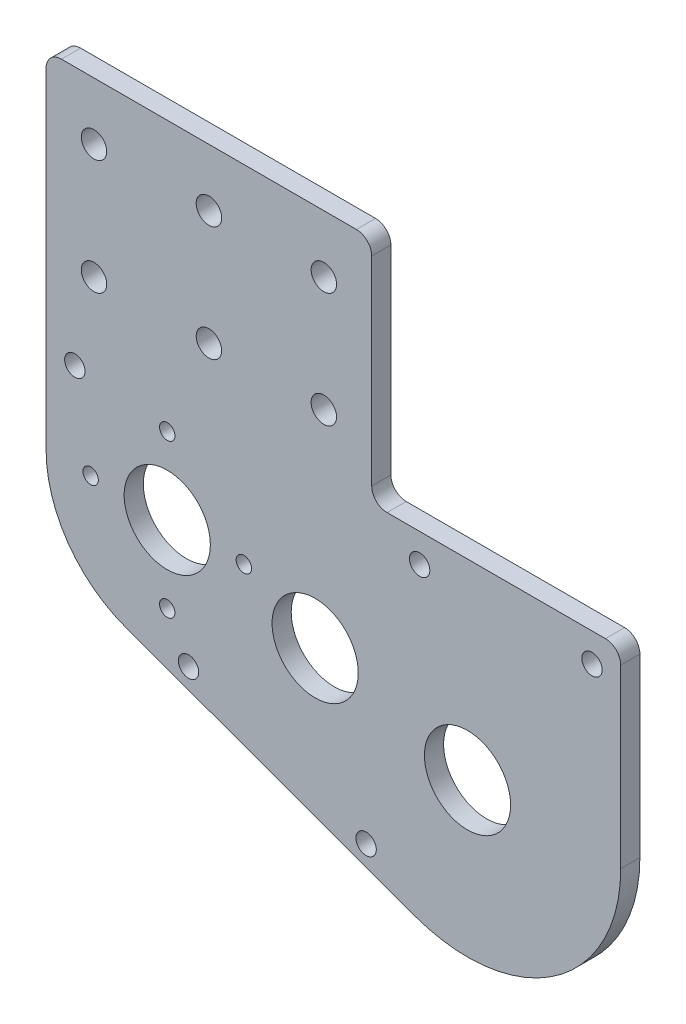
ISO-10303-21;
HEADER;
FILE_DESCRIPTION(('STEP AP214'),'2;1');
FILE_NAME('part.step','',(''),(''),'','','');
FILE_SCHEMA(('AUTOMOTIVE_DESIGN { 1 0 10303 214 1 1 1 1 }'));
ENDSEC;
DATA;
#1=APPLICATION_CONTEXT('core data for automotive mechanical design processes');
#2=APPLICATION_PROTOCOL_DEFINITION('international standard','automotive_design',2000,#1);
#3=PRODUCT_CONTEXT('',#1,'mechanical');
#4=PRODUCT('Part','Part','',(#3));
#5=PRODUCT_RELATED_PRODUCT_CATEGORY('part','',(#4));
#6=PRODUCT_DEFINITION_FORMATION('','',#4);
#7=PRODUCT_DEFINITION_CONTEXT('part definition',#1,'design');
#8=PRODUCT_DEFINITION('design','',#6,#7);
#9=PRODUCT_DEFINITION_SHAPE('','',#8);
#10=(LENGTH_UNIT() NAMED_UNIT(*) SI_UNIT(.MILLI.,.METRE.));
#11=(NAMED_UNIT(*) PLANE_ANGLE_UNIT() SI_UNIT($,.RADIAN.));
#12=(NAMED_UNIT(*) SI_UNIT($,.STERADIAN.) SOLID_ANGLE_UNIT());
#13=UNCERTAINTY_MEASURE_WITH_UNIT(LENGTH_MEASURE(1.E-05),#10,'distance_accuracy_value','');
#14=(GEOMETRIC_REPRESENTATION_CONTEXT(3) GLOBAL_UNCERTAINTY_ASSIGNED_CONTEXT((#13)) GLOBAL_UNIT_ASSIGNED_CONTEXT((#10,
#11,#12)) REPRESENTATION_CONTEXT('',''));
#15=CARTESIAN_POINT('',(0.,0.,0.));
#16=DIRECTION('',(0.,0.,1.));
#17=DIRECTION('',(1.,0.,0.));
#18=AXIS2_PLACEMENT_3D('',#15,#16,#17);
#19=CARTESIAN_POINT('',(50.8,63.5,-6.35));
#20=DIRECTION('',(0.,1.,0.));
#21=DIRECTION('',(-1.,0.,0.));
#22=AXIS2_PLACEMENT_3D('',#19,#20,#21);
#23=PLANE('',#22);
#24=DIRECTION('',(-1.,0.,0.));
#25=VECTOR('',#24,1.);
#26=CARTESIAN_POINT('',(50.8,63.5,0.));
#27=LINE('',#26,#25);
#28=CARTESIAN_POINT('',(45.72,63.5,0.));
#29=VERTEX_POINT('',#28);
#30=CARTESIAN_POINT('',(-26.67,63.5,0.));
#31=VERTEX_POINT('',#30);
#32=EDGE_CURVE('E167',#29,#31,#27,.T.);
#33=ORIENTED_EDGE('',*,*,#32,.F.);
#34=DIRECTION('',(0.,0.,1.));
#35=VECTOR('',#34,1.);
#36=CARTESIAN_POINT('',(45.72,63.5,-6.35));
#37=LINE('',#36,#35);
#38=CARTESIAN_POINT('',(45.72,63.5,-6.35));
#39=VERTEX_POINT('',#38);
#40=EDGE_CURVE('E198',#29,#39,#37,.F.);
#41=ORIENTED_EDGE('',*,*,#40,.T.);
#42=DIRECTION('',(-1.,0.,0.));
#43=VECTOR('',#42,1.);
#44=CARTESIAN_POINT('',(50.8,63.5,-6.35));
#45=LINE('',#44,#43);
#46=CARTESIAN_POINT('',(-26.67,63.5,-6.35));
#47=VERTEX_POINT('',#46);
#48=EDGE_CURVE('E142',#39,#47,#45,.T.);
#49=ORIENTED_EDGE('',*,*,#48,.T.);
#50=DIRECTION('',(0.,0.,1.));
#51=VECTOR('',#50,1.);
#52=CARTESIAN_POINT('',(-26.67,63.5,0.));
#53=LINE('',#52,#51);
#54=EDGE_CURVE('E195',#47,#31,#53,.T.);
#55=ORIENTED_EDGE('',*,*,#54,.T.);
#56=EDGE_LOOP('',(#33,#41,#49,#55));
#57=FACE_BOUND('',#56,.T.);
#58=ADVANCED_FACE('F41',(#57),#23,.T.);
#59=CARTESIAN_POINT('',(50.8,63.5,-6.35));
#60=DIRECTION('',(1.,0.,0.));
#61=DIRECTION('',(0.,0.,-1.));
#62=AXIS2_PLACEMENT_3D('',#59,#60,#61);
#63=PLANE('',#62);
#64=DIRECTION('',(0.,1.,0.));
#65=VECTOR('',#64,1.);
#66=CARTESIAN_POINT('',(50.8,63.5,-6.35));
#67=LINE('',#66,#65);
#68=CARTESIAN_POINT('',(50.8,0.,-6.35));
#69=VERTEX_POINT('',#68);
#70=CARTESIAN_POINT('',(50.8,58.42,-6.35));
#71=VERTEX_POINT('',#70);
#72=EDGE_CURVE('E180',#69,#71,#67,.T.);
#73=ORIENTED_EDGE('',*,*,#72,.T.);
#74=DIRECTION('',(0.,0.,1.));
#75=VECTOR('',#74,1.);
#76=CARTESIAN_POINT('',(50.8,58.42,-6.35));
#77=LINE('',#76,#75);
#78=CARTESIAN_POINT('',(50.8,58.42,0.));
#79=VERTEX_POINT('',#78);
#80=EDGE_CURVE('E183',#71,#79,#77,.T.);
#81=ORIENTED_EDGE('',*,*,#80,.T.);
#82=DIRECTION('',(0.,1.,0.));
#83=VECTOR('',#82,1.);
#84=CARTESIAN_POINT('',(50.8,63.5,0.));
#85=LINE('',#84,#83);
#86=CARTESIAN_POINT('',(50.8,0.,0.));
#87=VERTEX_POINT('',#86);
#88=EDGE_CURVE('E164',#87,#79,#85,.T.);
#89=ORIENTED_EDGE('',*,*,#88,.F.);
#90=DIRECTION('',(0.,0.,1.));
#91=VECTOR('',#90,1.);
#92=CARTESIAN_POINT('',(50.8,0.,-6.35));
#93=LINE('',#92,#91);
#94=EDGE_CURVE('E181',#69,#87,#93,.T.);
#95=ORIENTED_EDGE('',*,*,#94,.F.);
#96=EDGE_LOOP('',(#73,#81,#89,#95));
#97=FACE_BOUND('',#96,.T.);
#98=ADVANCED_FACE('F399',(#97),#63,.T.);
#99=CARTESIAN_POINT('',(0.,0.,-6.35));
#100=DIRECTION('',(0.,0.,1.));
#101=DIRECTION('',(1.,0.,0.));
#102=AXIS2_PLACEMENT_3D('',#99,#100,#101);
#103=CYLINDRICAL_SURFACE('',#102,50.8);
#104=CARTESIAN_POINT('',(0.,0.,0.));
#105=DIRECTION('',(0.,0.,1.));
#106=DIRECTION('',(-1.,0.,0.));
#107=AXIS2_PLACEMENT_3D('',#104,#105,#106);
#108=CIRCLE('',#107,50.8);
#109=CARTESIAN_POINT('',(-17.3899869073601,-47.7307904330302,0.));
#110=VERTEX_POINT('',#109);
#111=EDGE_CURVE('E177',#110,#87,#108,.T.);
#112=ORIENTED_EDGE('',*,*,#111,.F.);
#113=DIRECTION('',(0.,0.,1.));
#114=VECTOR('',#113,1.);
#115=CARTESIAN_POINT('',(-17.3899869073601,-47.7307904330302,-6.35));
#116=LINE('',#115,#114);
#117=CARTESIAN_POINT('',(-17.3899869073601,-47.7307904330302,-6.35));
#118=VERTEX_POINT('',#117);
#119=EDGE_CURVE('E184',#118,#110,#116,.T.);
#120=ORIENTED_EDGE('',*,*,#119,.F.);
#121=CARTESIAN_POINT('',(0.,0.,-6.35));
#122=DIRECTION('',(0.,0.,1.));
#123=DIRECTION('',(-1.,0.,0.));
#124=AXIS2_PLACEMENT_3D('',#121,#122,#123);
#125=CIRCLE('',#124,50.8);
#126=EDGE_CURVE('E150',#118,#69,#125,.T.);
#127=ORIENTED_EDGE('',*,*,#126,.T.);
#128=ORIENTED_EDGE('',*,*,#94,.T.);
#129=EDGE_LOOP('',(#112,#120,#127,#128));
#130=FACE_BOUND('',#129,.T.);
#131=ADVANCED_FACE('F405',(#130),#103,.T.);
#132=CARTESIAN_POINT('',(-17.3899869073601,-47.7307904330302,-6.35));
#133=DIRECTION('',(-0.342322576916537,-0.939582488839176,0.));
#134=DIRECTION('',(0.939582488839177,-0.342322576916537,0.));
#135=AXIS2_PLACEMENT_3D('',#132,#133,#134);
#136=PLANE('',#135);
#137=DIRECTION('',(0.939582488839176,-0.342322576916537,0.));
#138=VECTOR('',#137,1.);
#139=CARTESIAN_POINT('',(-17.3899869073601,-47.7307904330302,0.));
#140=LINE('',#139,#138);
#141=CARTESIAN_POINT('',(-113.286645892622,-12.7923025286006,0.));
#142=VERTEX_POINT('',#141);
#143=EDGE_CURVE('E174',#142,#110,#140,.T.);
#144=ORIENTED_EDGE('',*,*,#143,.F.);
#145=DIRECTION('',(0.,0.,1.));
#146=VECTOR('',#145,1.);
#147=CARTESIAN_POINT('',(-113.286645892622,-12.7923025286006,-6.35));
#148=LINE('',#147,#146);
#149=CARTESIAN_POINT('',(-113.286645892622,-12.7923025286006,-6.35));
#150=VERTEX_POINT('',#149);
#151=EDGE_CURVE('E149',#150,#142,#148,.T.);
#152=ORIENTED_EDGE('',*,*,#151,.F.);
#153=DIRECTION('',(0.939582488839176,-0.342322576916537,0.));
#154=VECTOR('',#153,1.);
#155=CARTESIAN_POINT('',(-17.3899869073601,-47.7307904330302,-6.35));
#156=LINE('',#155,#154);
#157=EDGE_CURVE('E157',#150,#118,#156,.T.);
#158=ORIENTED_EDGE('',*,*,#157,.T.);
#159=ORIENTED_EDGE('',*,*,#119,.T.);
#160=EDGE_LOOP('',(#144,#152,#158,#159));
#161=FACE_BOUND('',#160,.T.);
#162=ADVANCED_FACE('F432',(#161),#136,.T.);
#163=CARTESIAN_POINT('',(-99.5384357128441,24.9428,-6.35));
#164=DIRECTION('',(0.,0.,1.));
#165=DIRECTION('',(1.,0.,0.));
#166=AXIS2_PLACEMENT_3D('',#163,#164,#165);
#167=CYLINDRICAL_SURFACE('',#166,40.1615642871559);
#168=CARTESIAN_POINT('',(-99.5384357128441,24.9428,0.));
#169=DIRECTION('',(0.,0.,1.));
#170=DIRECTION('',(-1.,0.,0.));
#171=AXIS2_PLACEMENT_3D('',#168,#169,#170);
#172=CIRCLE('',#171,40.1615642871559);
#173=CARTESIAN_POINT('',(-139.7,24.9428,0.));
#174=VERTEX_POINT('',#173);
#175=EDGE_CURVE('E148',#174,#142,#172,.T.);
#176=ORIENTED_EDGE('',*,*,#175,.F.);
#177=DIRECTION('',(0.,0.,1.));
#178=VECTOR('',#177,1.);
#179=CARTESIAN_POINT('',(-139.7,24.9428,-6.35));
#180=LINE('',#179,#178);
#181=CARTESIAN_POINT('',(-139.7,24.9428,-6.35));
#182=VERTEX_POINT('',#181);
#183=EDGE_CURVE('E135',#182,#174,#180,.T.);
#184=ORIENTED_EDGE('',*,*,#183,.F.);
#185=CARTESIAN_POINT('',(-99.5384357128441,24.9428,-6.35));
#186=DIRECTION('',(0.,0.,1.));
#187=DIRECTION('',(-1.,0.,0.));
#188=AXIS2_PLACEMENT_3D('',#185,#186,#187);
#189=CIRCLE('',#188,40.1615642871559);
#190=EDGE_CURVE('E141',#182,#150,#189,.T.);
#191=ORIENTED_EDGE('',*,*,#190,.T.);
#192=ORIENTED_EDGE('',*,*,#151,.T.);
#193=EDGE_LOOP('',(#176,#184,#191,#192));
#194=FACE_BOUND('',#193,.T.);
#195=ADVANCED_FACE('F146',(#194),#167,.T.);
#196=CARTESIAN_POINT('',(-139.7,24.9428,-6.35));
#197=DIRECTION('',(-1.,0.,0.));
#198=DIRECTION('',(0.,-1.,0.));
#199=AXIS2_PLACEMENT_3D('',#196,#197,#198);
#200=PLANE('',#199);
#201=DIRECTION('',(0.,-1.,0.));
#202=VECTOR('',#201,1.);
#203=CARTESIAN_POINT('',(-139.7,24.9428,0.));
#204=LINE('',#203,#202);
#205=CARTESIAN_POINT('',(-139.7,134.62,0.));
#206=VERTEX_POINT('',#205);
#207=EDGE_CURVE('E171',#206,#174,#204,.T.);
#208=ORIENTED_EDGE('',*,*,#207,.F.);
#209=DIRECTION('',(0.,0.,1.));
#210=VECTOR('',#209,1.);
#211=CARTESIAN_POINT('',(-139.7,134.62,-6.35));
#212=LINE('',#211,#210);
#213=CARTESIAN_POINT('',(-139.7,134.62,-6.35));
#214=VERTEX_POINT('',#213);
#215=EDGE_CURVE('E138',#206,#214,#212,.F.);
#216=ORIENTED_EDGE('',*,*,#215,.T.);
#217=DIRECTION('',(0.,-1.,0.));
#218=VECTOR('',#217,1.);
#219=CARTESIAN_POINT('',(-139.7,24.9428,-6.35));
#220=LINE('',#219,#218);
#221=EDGE_CURVE('E131',#214,#182,#220,.T.);
#222=ORIENTED_EDGE('',*,*,#221,.T.);
#223=ORIENTED_EDGE('',*,*,#183,.T.);
#224=EDGE_LOOP('',(#208,#216,#222,#223));
#225=FACE_BOUND('',#224,.T.);
#226=ADVANCED_FACE('F134',(#225),#200,.T.);
#227=CARTESIAN_POINT('',(0.,0.,-6.35));
#228=DIRECTION('',(0.,0.,-1.));
#229=DIRECTION('',(-1.,0.,0.));
#230=AXIS2_PLACEMENT_3D('',#227,#228,#229);
#231=PLANE('',#230);
#232=CARTESIAN_POINT('',(-47.625,82.55,-6.35));
#233=DIRECTION('',(0.,0.,-1.));
#234=DIRECTION('',(-1.,0.,0.));
#235=AXIS2_PLACEMENT_3D('',#232,#233,#234);
#236=CIRCLE('',#235,4.21640000000001);
#237=CARTESIAN_POINT('',(-51.8414,82.55,-6.35));
#238=VERTEX_POINT('',#237);
#239=EDGE_CURVE('E331',#238,#238,#236,.F.);
#240=ORIENTED_EDGE('',*,*,#239,.T.);
#241=EDGE_LOOP('',(#240));
#242=FACE_BOUND('',#241,.T.);
#243=CARTESIAN_POINT('',(-85.725,82.55,-6.35));
#244=DIRECTION('',(0.,0.,-1.));
#245=DIRECTION('',(-1.,0.,0.));
#246=AXIS2_PLACEMENT_3D('',#243,#244,#245);
#247=CIRCLE('',#246,4.21639999999999);
#248=CARTESIAN_POINT('',(-89.9414,82.55,-6.35));
#249=VERTEX_POINT('',#248);
#250=EDGE_CURVE('E326',#249,#249,#247,.F.);
#251=ORIENTED_EDGE('',*,*,#250,.T.);
#252=EDGE_LOOP('',(#251));
#253=FACE_BOUND('',#252,.T.);
#254=CARTESIAN_POINT('',(-85.725,120.65,-6.35));
#255=DIRECTION('',(0.,0.,-1.));
#256=DIRECTION('',(-1.,0.,0.));
#257=AXIS2_PLACEMENT_3D('',#254,#255,#256);
#258=CIRCLE('',#257,4.21639999999999);
#259=CARTESIAN_POINT('',(-89.9414,120.65,-6.35));
#260=VERTEX_POINT('',#259);
#261=EDGE_CURVE('E319',#260,#260,#258,.F.);
#262=ORIENTED_EDGE('',*,*,#261,.T.);
#263=EDGE_LOOP('',(#262));
#264=FACE_BOUND('',#263,.T.);
#265=CARTESIAN_POINT('',(-123.825,82.55,-6.35));
#266=DIRECTION('',(0.,0.,-1.));
#267=DIRECTION('',(-1.,0.,0.));
#268=AXIS2_PLACEMENT_3D('',#265,#266,#267);
#269=CIRCLE('',#268,4.21639999999999);
#270=CARTESIAN_POINT('',(-128.0414,82.55,-6.35));
#271=VERTEX_POINT('',#270);
#272=EDGE_CURVE('E318',#271,#271,#269,.F.);
#273=ORIENTED_EDGE('',*,*,#272,.T.);
#274=EDGE_LOOP('',(#273));
#275=FACE_BOUND('',#274,.T.);
#276=CARTESIAN_POINT('',(-47.625,120.65,-6.35));
#277=DIRECTION('',(0.,0.,-1.));
#278=DIRECTION('',(-1.,0.,0.));
#279=AXIS2_PLACEMENT_3D('',#276,#277,#278);
#280=CIRCLE('',#279,4.21640000000001);
#281=CARTESIAN_POINT('',(-51.8414,120.65,-6.35));
#282=VERTEX_POINT('',#281);
#283=EDGE_CURVE('E338',#282,#282,#280,.F.);
#284=ORIENTED_EDGE('',*,*,#283,.T.);
#285=EDGE_LOOP('',(#284));
#286=FACE_BOUND('',#285,.T.);
#287=CARTESIAN_POINT('',(-123.825,120.65,-6.35));
#288=DIRECTION('',(0.,0.,-1.));
#289=DIRECTION('',(-1.,0.,0.));
#290=AXIS2_PLACEMENT_3D('',#287,#288,#289);
#291=CIRCLE('',#290,4.21639999999999);
#292=CARTESIAN_POINT('',(-128.0414,120.65,-6.35));
#293=VERTEX_POINT('',#292);
#294=EDGE_CURVE('E312',#293,#293,#291,.F.);
#295=ORIENTED_EDGE('',*,*,#294,.T.);
#296=EDGE_LOOP('',(#295));
#297=FACE_BOUND('',#296,.T.);
#298=CARTESIAN_POINT('',(-33.6126326232561,-35.061995487122,-6.35));
#299=DIRECTION('',(0.,0.,1.));
#300=DIRECTION('',(1.,0.,0.));
#301=AXIS2_PLACEMENT_3D('',#298,#299,#300);
#302=CIRCLE('',#301,3.3782);
#303=CARTESIAN_POINT('',(-30.2344326232561,-35.061995487122,-6.35));
#304=VERTEX_POINT('',#303);
#305=EDGE_CURVE('E306',#304,#304,#302,.T.);
#306=ORIENTED_EDGE('',*,*,#305,.T.);
#307=EDGE_LOOP('',(#306));
#308=FACE_BOUND('',#307,.T.);
#309=CARTESIAN_POINT('',(-92.482563874237,-13.6136321894695,-6.35));
#310=DIRECTION('',(0.,0.,1.));
#311=DIRECTION('',(1.,0.,0.));
#312=AXIS2_PLACEMENT_3D('',#309,#310,#311);
#313=CIRCLE('',#312,3.3782);
#314=CARTESIAN_POINT('',(-89.104363874237,-13.6136321894695,-6.35));
#315=VERTEX_POINT('',#314);
#316=EDGE_CURVE('E300',#315,#315,#313,.T.);
#317=ORIENTED_EDGE('',*,*,#316,.T.);
#318=EDGE_LOOP('',(#317));
#319=FACE_BOUND('',#318,.T.);
#320=CARTESIAN_POINT('',(-130.175,53.975,-6.35));
#321=DIRECTION('',(0.,0.,1.));
#322=DIRECTION('',(1.,0.,0.));
#323=AXIS2_PLACEMENT_3D('',#320,#321,#322);
#324=CIRCLE('',#323,3.3782);
#325=CARTESIAN_POINT('',(-126.7968,53.975,-6.35));
#326=VERTEX_POINT('',#325);
#327=EDGE_CURVE('E294',#326,#326,#324,.T.);
#328=ORIENTED_EDGE('',*,*,#327,.T.);
#329=EDGE_LOOP('',(#328));
#330=FACE_BOUND('',#329,.T.);
#331=CARTESIAN_POINT('',(-15.875,53.975,-6.35));
#332=DIRECTION('',(0.,0.,1.));
#333=DIRECTION('',(1.,0.,0.));
#334=AXIS2_PLACEMENT_3D('',#331,#332,#333);
#335=CIRCLE('',#334,3.3782);
#336=CARTESIAN_POINT('',(-12.4968,53.975,-6.35));
#337=VERTEX_POINT('',#336);
#338=EDGE_CURVE('E288',#337,#337,#335,.T.);
#339=ORIENTED_EDGE('',*,*,#338,.T.);
#340=EDGE_LOOP('',(#339));
#341=FACE_BOUND('',#340,.T.);
#342=CARTESIAN_POINT('',(41.275,53.975,-6.35));
#343=DIRECTION('',(0.,0.,1.));
#344=DIRECTION('',(1.,0.,0.));
#345=AXIS2_PLACEMENT_3D('',#342,#343,#344);
#346=CIRCLE('',#345,3.3782);
#347=CARTESIAN_POINT('',(44.6532,53.975,-6.35));
#348=VERTEX_POINT('',#347);
#349=EDGE_CURVE('E282',#348,#348,#346,.T.);
#350=ORIENTED_EDGE('',*,*,#349,.T.);
#351=EDGE_LOOP('',(#350));
#352=FACE_BOUND('',#351,.T.);
#353=CARTESIAN_POINT('',(-124.938435712844,24.9428,-6.35));
#354=DIRECTION('',(0.,0.,1.));
#355=DIRECTION('',(1.,0.,0.));
#356=AXIS2_PLACEMENT_3D('',#353,#354,#355);
#357=CIRCLE('',#356,2.55269999999999);
#358=CARTESIAN_POINT('',(-122.385735712844,24.9428,-6.35));
#359=VERTEX_POINT('',#358);
#360=EDGE_CURVE('E276',#359,#359,#357,.T.);
#361=ORIENTED_EDGE('',*,*,#360,.T.);
#362=EDGE_LOOP('',(#361));
#363=FACE_BOUND('',#362,.T.);
#364=CARTESIAN_POINT('',(-99.5384357128441,50.3428,-6.35));
#365=DIRECTION('',(0.,0.,1.));
#366=DIRECTION('',(1.,0.,0.));
#367=AXIS2_PLACEMENT_3D('',#364,#365,#366);
#368=CIRCLE('',#367,2.55269999999999);
#369=CARTESIAN_POINT('',(-96.9857357128441,50.3428,-6.35));
#370=VERTEX_POINT('',#369);
#371=EDGE_CURVE('E270',#370,#370,#368,.T.);
#372=ORIENTED_EDGE('',*,*,#371,.T.);
#373=EDGE_LOOP('',(#372));
#374=FACE_BOUND('',#373,.T.);
#375=CARTESIAN_POINT('',(-74.1384357128441,24.9428,-6.35));
#376=DIRECTION('',(0.,0.,1.));
#377=DIRECTION('',(1.,0.,0.));
#378=AXIS2_PLACEMENT_3D('',#375,#376,#377);
#379=CIRCLE('',#378,2.55269999999999);
#380=CARTESIAN_POINT('',(-71.5857357128441,24.9428,-6.35));
#381=VERTEX_POINT('',#380);
#382=EDGE_CURVE('E264',#381,#381,#379,.T.);
#383=ORIENTED_EDGE('',*,*,#382,.T.);
#384=EDGE_LOOP('',(#383));
#385=FACE_BOUND('',#384,.T.);
#386=CARTESIAN_POINT('',(-99.5384357128441,-0.457199999999998,-6.35));
#387=DIRECTION('',(0.,0.,1.));
#388=DIRECTION('',(1.,0.,0.));
#389=AXIS2_PLACEMENT_3D('',#386,#387,#388);
#390=CIRCLE('',#389,2.55269999999999);
#391=CARTESIAN_POINT('',(-96.9857357128441,-0.457199999999998,-6.35));
#392=VERTEX_POINT('',#391);
#393=EDGE_CURVE('E245',#392,#392,#390,.T.);
#394=ORIENTED_EDGE('',*,*,#393,.T.);
#395=EDGE_LOOP('',(#394));
#396=FACE_BOUND('',#395,.T.);
#397=CARTESIAN_POINT('',(0.,0.,-6.35));
#398=DIRECTION('',(0.,0.,-1.));
#399=DIRECTION('',(-1.,0.,0.));
#400=AXIS2_PLACEMENT_3D('',#397,#398,#399);
#401=CIRCLE('',#400,14.2875);
#402=CARTESIAN_POINT('',(-14.2875,0.,-6.35));
#403=VERTEX_POINT('',#402);
#404=EDGE_CURVE('E254',#403,#403,#401,.F.);
#405=ORIENTED_EDGE('',*,*,#404,.T.);
#406=EDGE_LOOP('',(#405));
#407=FACE_BOUND('',#406,.T.);
#408=CARTESIAN_POINT('',(-50.5083646562699,12.6566188118812,-6.35));
#409=DIRECTION('',(0.,0.,-1.));
#410=DIRECTION('',(-1.,0.,0.));
#411=AXIS2_PLACEMENT_3D('',#408,#409,#410);
#412=CIRCLE('',#411,14.2875);
#413=CARTESIAN_POINT('',(-64.7958646562699,12.6566188118812,-6.35));
#414=VERTEX_POINT('',#413);
#415=EDGE_CURVE('E251',#414,#414,#412,.F.);
#416=ORIENTED_EDGE('',*,*,#415,.T.);
#417=EDGE_LOOP('',(#416));
#418=FACE_BOUND('',#417,.T.);
#419=CARTESIAN_POINT('',(-99.5384357128441,24.9428,-6.35));
#420=DIRECTION('',(0.,0.,-1.));
#421=DIRECTION('',(-1.,0.,0.));
#422=AXIS2_PLACEMENT_3D('',#419,#420,#421);
#423=CIRCLE('',#422,14.2875);
#424=CARTESIAN_POINT('',(-113.825935712844,24.9428,-6.35));
#425=VERTEX_POINT('',#424);
#426=EDGE_CURVE('E244',#425,#425,#423,.F.);
#427=ORIENTED_EDGE('',*,*,#426,.T.);
#428=EDGE_LOOP('',(#427));
#429=FACE_BOUND('',#428,.T.);
#430=ORIENTED_EDGE('',*,*,#48,.F.);
#431=CARTESIAN_POINT('',(45.72,58.42,-6.35));
#432=DIRECTION('',(0.,0.,-1.));
#433=DIRECTION('',(-1.,0.,0.));
#434=AXIS2_PLACEMENT_3D('',#431,#432,#433);
#435=CIRCLE('',#434,5.08);
#436=EDGE_CURVE('E203',#39,#71,#435,.T.);
#437=ORIENTED_EDGE('',*,*,#436,.T.);
#438=ORIENTED_EDGE('',*,*,#72,.F.);
#439=ORIENTED_EDGE('',*,*,#126,.F.);
#440=ORIENTED_EDGE('',*,*,#157,.F.);
#441=ORIENTED_EDGE('',*,*,#190,.F.);
#442=ORIENTED_EDGE('',*,*,#221,.F.);
#443=CARTESIAN_POINT('',(-134.62,134.62,-6.34999999999999));
#444=DIRECTION('',(0.,0.,-1.));
#445=DIRECTION('',(-1.,0.,0.));
#446=AXIS2_PLACEMENT_3D('',#443,#444,#445);
#447=CIRCLE('',#446,5.08);
#448=CARTESIAN_POINT('',(-134.62,139.7,-6.34999999999999));
#449=VERTEX_POINT('',#448);
#450=EDGE_CURVE('E200',#214,#449,#447,.T.);
#451=ORIENTED_EDGE('',*,*,#450,.T.);
#452=DIRECTION('',(-1.,0.,0.));
#453=VECTOR('',#452,1.);
#454=CARTESIAN_POINT('',(-139.7,139.7,-6.34999999999999));
#455=LINE('',#454,#453);
#456=CARTESIAN_POINT('',(-36.83,139.7,-6.34999999999999));
#457=VERTEX_POINT('',#456);
#458=EDGE_CURVE('E168',#457,#449,#455,.T.);
#459=ORIENTED_EDGE('',*,*,#458,.F.);
#460=CARTESIAN_POINT('',(-36.83,134.62,-6.34999999999999));
#461=DIRECTION('',(0.,0.,-1.));
#462=DIRECTION('',(-1.,0.,0.));
#463=AXIS2_PLACEMENT_3D('',#460,#461,#462);
#464=CIRCLE('',#463,5.08);
#465=CARTESIAN_POINT('',(-31.75,134.62,-6.34999999999999));
#466=VERTEX_POINT('',#465);
#467=EDGE_CURVE('E56',#457,#466,#464,.T.);
#468=ORIENTED_EDGE('',*,*,#467,.T.);
#469=DIRECTION('',(0.,1.,0.));
#470=VECTOR('',#469,1.);
#471=CARTESIAN_POINT('',(-31.75,139.7,-6.34999999999999));
#472=LINE('',#471,#470);
#473=CARTESIAN_POINT('',(-31.75,68.58,-6.34999999999999));
#474=VERTEX_POINT('',#473);
#475=EDGE_CURVE('E230',#474,#466,#472,.T.);
#476=ORIENTED_EDGE('',*,*,#475,.F.);
#477=CARTESIAN_POINT('',(-26.67,68.58,-6.35));
#478=DIRECTION('',(0.,0.,-1.));
#479=DIRECTION('',(-1.,0.,0.));
#480=AXIS2_PLACEMENT_3D('',#477,#478,#479);
#481=CIRCLE('',#480,5.08);
#482=EDGE_CURVE('E11',#474,#47,#481,.F.);
#483=ORIENTED_EDGE('',*,*,#482,.T.);
#484=EDGE_LOOP('',(#430,#437,#438,#439,#440,#441,#442,#451,#459,#468,#476,#483));
#485=FACE_BOUND('',#484,.T.);
#486=ADVANCED_FACE('F154',(#242,#253,#264,#275,#286,#297,#308,#319,#330,#341,#352,#363,#374,
#385,#396,#407,#418,#429,#485),#231,.T.);
#487=CARTESIAN_POINT('',(0.,0.,0.));
#488=DIRECTION('',(0.,0.,-1.));
#489=DIRECTION('',(-1.,0.,0.));
#490=AXIS2_PLACEMENT_3D('',#487,#488,#489);
#491=PLANE('',#490);
#492=CARTESIAN_POINT('',(-47.625,82.55,0.));
#493=DIRECTION('',(0.,0.,1.));
#494=DIRECTION('',(1.,0.,0.));
#495=AXIS2_PLACEMENT_3D('',#492,#493,#494);
#496=CIRCLE('',#495,4.21640000000001);
#497=CARTESIAN_POINT('',(-43.4086,82.55,0.));
#498=VERTEX_POINT('',#497);
#499=EDGE_CURVE('E335',#498,#498,#496,.T.);
#500=ORIENTED_EDGE('',*,*,#499,.F.);
#501=EDGE_LOOP('',(#500));
#502=FACE_BOUND('',#501,.T.);
#503=CARTESIAN_POINT('',(-85.725,82.55,0.));
#504=DIRECTION('',(0.,0.,1.));
#505=DIRECTION('',(1.,0.,0.));
#506=AXIS2_PLACEMENT_3D('',#503,#504,#505);
#507=CIRCLE('',#506,4.21639999999999);
#508=CARTESIAN_POINT('',(-81.5086,82.55,0.));
#509=VERTEX_POINT('',#508);
#510=EDGE_CURVE('E334',#509,#509,#507,.T.);
#511=ORIENTED_EDGE('',*,*,#510,.F.);
#512=EDGE_LOOP('',(#511));
#513=FACE_BOUND('',#512,.T.);
#514=CARTESIAN_POINT('',(-85.725,120.65,0.));
#515=DIRECTION('',(0.,0.,1.));
#516=DIRECTION('',(1.,0.,0.));
#517=AXIS2_PLACEMENT_3D('',#514,#515,#516);
#518=CIRCLE('',#517,4.21639999999999);
#519=CARTESIAN_POINT('',(-81.5086,120.65,0.));
#520=VERTEX_POINT('',#519);
#521=EDGE_CURVE('E323',#520,#520,#518,.T.);
#522=ORIENTED_EDGE('',*,*,#521,.F.);
#523=EDGE_LOOP('',(#522));
#524=FACE_BOUND('',#523,.T.);
#525=CARTESIAN_POINT('',(-123.825,82.55,0.));
#526=DIRECTION('',(0.,0.,1.));
#527=DIRECTION('',(1.,0.,0.));
#528=AXIS2_PLACEMENT_3D('',#525,#526,#527);
#529=CIRCLE('',#528,4.21639999999999);
#530=CARTESIAN_POINT('',(-119.6086,82.55,0.));
#531=VERTEX_POINT('',#530);
#532=EDGE_CURVE('E322',#531,#531,#529,.T.);
#533=ORIENTED_EDGE('',*,*,#532,.F.);
#534=EDGE_LOOP('',(#533));
#535=FACE_BOUND('',#534,.T.);
#536=CARTESIAN_POINT('',(-47.625,120.65,0.));
#537=DIRECTION('',(0.,0.,1.));
#538=DIRECTION('',(1.,0.,0.));
#539=AXIS2_PLACEMENT_3D('',#536,#537,#538);
#540=CIRCLE('',#539,4.21640000000001);
#541=CARTESIAN_POINT('',(-43.4086,120.65,0.));
#542=VERTEX_POINT('',#541);
#543=EDGE_CURVE('E345',#542,#542,#540,.T.);
#544=ORIENTED_EDGE('',*,*,#543,.F.);
#545=EDGE_LOOP('',(#544));
#546=FACE_BOUND('',#545,.T.);
#547=CARTESIAN_POINT('',(-123.825,120.65,0.));
#548=DIRECTION('',(0.,0.,1.));
#549=DIRECTION('',(1.,0.,0.));
#550=AXIS2_PLACEMENT_3D('',#547,#548,#549);
#551=CIRCLE('',#550,4.21639999999999);
#552=CARTESIAN_POINT('',(-119.6086,120.65,0.));
#553=VERTEX_POINT('',#552);
#554=EDGE_CURVE('E315',#553,#553,#551,.T.);
#555=ORIENTED_EDGE('',*,*,#554,.F.);
#556=EDGE_LOOP('',(#555));
#557=FACE_BOUND('',#556,.T.);
#558=CARTESIAN_POINT('',(-33.6126326232561,-35.061995487122,0.));
#559=DIRECTION('',(0.,0.,1.));
#560=DIRECTION('',(1.,0.,0.));
#561=AXIS2_PLACEMENT_3D('',#558,#559,#560);
#562=CIRCLE('',#561,3.3782);
#563=CARTESIAN_POINT('',(-30.2344326232561,-35.061995487122,0.));
#564=VERTEX_POINT('',#563);
#565=EDGE_CURVE('E309',#564,#564,#562,.T.);
#566=ORIENTED_EDGE('',*,*,#565,.F.);
#567=EDGE_LOOP('',(#566));
#568=FACE_BOUND('',#567,.T.);
#569=CARTESIAN_POINT('',(-92.482563874237,-13.6136321894695,0.));
#570=DIRECTION('',(0.,0.,1.));
#571=DIRECTION('',(1.,0.,0.));
#572=AXIS2_PLACEMENT_3D('',#569,#570,#571);
#573=CIRCLE('',#572,3.3782);
#574=CARTESIAN_POINT('',(-89.104363874237,-13.6136321894695,0.));
#575=VERTEX_POINT('',#574);
#576=EDGE_CURVE('E303',#575,#575,#573,.T.);
#577=ORIENTED_EDGE('',*,*,#576,.F.);
#578=EDGE_LOOP('',(#577));
#579=FACE_BOUND('',#578,.T.);
#580=CARTESIAN_POINT('',(-130.175,53.975,0.));
#581=DIRECTION('',(0.,0.,1.));
#582=DIRECTION('',(1.,0.,0.));
#583=AXIS2_PLACEMENT_3D('',#580,#581,#582);
#584=CIRCLE('',#583,3.3782);
#585=CARTESIAN_POINT('',(-126.7968,53.975,0.));
#586=VERTEX_POINT('',#585);
#587=EDGE_CURVE('E297',#586,#586,#584,.T.);
#588=ORIENTED_EDGE('',*,*,#587,.F.);
#589=EDGE_LOOP('',(#588));
#590=FACE_BOUND('',#589,.T.);
#591=CARTESIAN_POINT('',(-15.875,53.975,0.));
#592=DIRECTION('',(0.,0.,1.));
#593=DIRECTION('',(1.,0.,0.));
#594=AXIS2_PLACEMENT_3D('',#591,#592,#593);
#595=CIRCLE('',#594,3.3782);
#596=CARTESIAN_POINT('',(-12.4968,53.975,0.));
#597=VERTEX_POINT('',#596);
#598=EDGE_CURVE('E291',#597,#597,#595,.T.);
#599=ORIENTED_EDGE('',*,*,#598,.F.);
#600=EDGE_LOOP('',(#599));
#601=FACE_BOUND('',#600,.T.);
#602=CARTESIAN_POINT('',(41.275,53.975,0.));
#603=DIRECTION('',(0.,0.,1.));
#604=DIRECTION('',(1.,0.,0.));
#605=AXIS2_PLACEMENT_3D('',#602,#603,#604);
#606=CIRCLE('',#605,3.3782);
#607=CARTESIAN_POINT('',(44.6532,53.975,0.));
#608=VERTEX_POINT('',#607);
#609=EDGE_CURVE('E285',#608,#608,#606,.T.);
#610=ORIENTED_EDGE('',*,*,#609,.F.);
#611=EDGE_LOOP('',(#610));
#612=FACE_BOUND('',#611,.T.);
#613=CARTESIAN_POINT('',(-124.938435712844,24.9428,0.));
#614=DIRECTION('',(0.,0.,1.));
#615=DIRECTION('',(1.,0.,0.));
#616=AXIS2_PLACEMENT_3D('',#613,#614,#615);
#617=CIRCLE('',#616,2.55269999999999);
#618=CARTESIAN_POINT('',(-122.385735712844,24.9428,0.));
#619=VERTEX_POINT('',#618);
#620=EDGE_CURVE('E279',#619,#619,#617,.T.);
#621=ORIENTED_EDGE('',*,*,#620,.F.);
#622=EDGE_LOOP('',(#621));
#623=FACE_BOUND('',#622,.T.);
#624=CARTESIAN_POINT('',(-99.5384357128441,50.3428,0.));
#625=DIRECTION('',(0.,0.,1.));
#626=DIRECTION('',(1.,0.,0.));
#627=AXIS2_PLACEMENT_3D('',#624,#625,#626);
#628=CIRCLE('',#627,2.55269999999999);
#629=CARTESIAN_POINT('',(-96.9857357128441,50.3428,0.));
#630=VERTEX_POINT('',#629);
#631=EDGE_CURVE('E273',#630,#630,#628,.T.);
#632=ORIENTED_EDGE('',*,*,#631,.F.);
#633=EDGE_LOOP('',(#632));
#634=FACE_BOUND('',#633,.T.);
#635=CARTESIAN_POINT('',(-74.1384357128441,24.9428,0.));
#636=DIRECTION('',(0.,0.,1.));
#637=DIRECTION('',(1.,0.,0.));
#638=AXIS2_PLACEMENT_3D('',#635,#636,#637);
#639=CIRCLE('',#638,2.55269999999999);
#640=CARTESIAN_POINT('',(-71.5857357128441,24.9428,0.));
#641=VERTEX_POINT('',#640);
#642=EDGE_CURVE('E267',#641,#641,#639,.T.);
#643=ORIENTED_EDGE('',*,*,#642,.F.);
#644=EDGE_LOOP('',(#643));
#645=FACE_BOUND('',#644,.T.);
#646=CARTESIAN_POINT('',(-99.5384357128441,-0.457199999999998,0.));
#647=DIRECTION('',(0.,0.,1.));
#648=DIRECTION('',(1.,0.,0.));
#649=AXIS2_PLACEMENT_3D('',#646,#647,#648);
#650=CIRCLE('',#649,2.55269999999999);
#651=CARTESIAN_POINT('',(-96.9857357128441,-0.457199999999998,0.));
#652=VERTEX_POINT('',#651);
#653=EDGE_CURVE('E261',#652,#652,#650,.T.);
#654=ORIENTED_EDGE('',*,*,#653,.F.);
#655=EDGE_LOOP('',(#654));
#656=FACE_BOUND('',#655,.T.);
#657=CARTESIAN_POINT('',(0.,0.,0.));
#658=DIRECTION('',(0.,0.,1.));
#659=DIRECTION('',(1.,0.,0.));
#660=AXIS2_PLACEMENT_3D('',#657,#658,#659);
#661=CIRCLE('',#660,14.2875);
#662=CARTESIAN_POINT('',(14.2875,0.,0.));
#663=VERTEX_POINT('',#662);
#664=EDGE_CURVE('E224',#663,#663,#661,.T.);
#665=ORIENTED_EDGE('',*,*,#664,.F.);
#666=EDGE_LOOP('',(#665));
#667=FACE_BOUND('',#666,.T.);
#668=CARTESIAN_POINT('',(-50.5083646562699,12.6566188118812,0.));
#669=DIRECTION('',(0.,0.,1.));
#670=DIRECTION('',(1.,0.,0.));
#671=AXIS2_PLACEMENT_3D('',#668,#669,#670);
#672=CIRCLE('',#671,14.2875);
#673=CARTESIAN_POINT('',(-36.2208646562699,12.6566188118812,0.));
#674=VERTEX_POINT('',#673);
#675=EDGE_CURVE('E248',#674,#674,#672,.T.);
#676=ORIENTED_EDGE('',*,*,#675,.F.);
#677=EDGE_LOOP('',(#676));
#678=FACE_BOUND('',#677,.T.);
#679=CARTESIAN_POINT('',(-99.5384357128441,24.9428,0.));
#680=DIRECTION('',(0.,0.,1.));
#681=DIRECTION('',(1.,0.,0.));
#682=AXIS2_PLACEMENT_3D('',#679,#680,#681);
#683=CIRCLE('',#682,14.2875);
#684=CARTESIAN_POINT('',(-85.2509357128441,24.9428,0.));
#685=VERTEX_POINT('',#684);
#686=EDGE_CURVE('E241',#685,#685,#683,.T.);
#687=ORIENTED_EDGE('',*,*,#686,.F.);
#688=EDGE_LOOP('',(#687));
#689=FACE_BOUND('',#688,.T.);
#690=ORIENTED_EDGE('',*,*,#88,.T.);
#691=CARTESIAN_POINT('',(45.72,58.42,0.));
#692=DIRECTION('',(0.,0.,-1.));
#693=DIRECTION('',(-1.,0.,0.));
#694=AXIS2_PLACEMENT_3D('',#691,#692,#693);
#695=CIRCLE('',#694,5.08);
#696=EDGE_CURVE('E193',#79,#29,#695,.F.);
#697=ORIENTED_EDGE('',*,*,#696,.T.);
#698=ORIENTED_EDGE('',*,*,#32,.T.);
#699=CARTESIAN_POINT('',(-26.67,68.58,0.));
#700=DIRECTION('',(0.,0.,-1.));
#701=DIRECTION('',(-1.,0.,0.));
#702=AXIS2_PLACEMENT_3D('',#699,#700,#701);
#703=CIRCLE('',#702,5.08);
#704=CARTESIAN_POINT('',(-31.75,68.58,0.));
#705=VERTEX_POINT('',#704);
#706=EDGE_CURVE('E49',#31,#705,#703,.T.);
#707=ORIENTED_EDGE('',*,*,#706,.T.);
#708=DIRECTION('',(0.,1.,0.));
#709=VECTOR('',#708,1.);
#710=CARTESIAN_POINT('',(-31.75,139.7,0.));
#711=LINE('',#710,#709);
#712=CARTESIAN_POINT('',(-31.75,134.62,0.));
#713=VERTEX_POINT('',#712);
#714=EDGE_CURVE('E217',#705,#713,#711,.T.);
#715=ORIENTED_EDGE('',*,*,#714,.T.);
#716=CARTESIAN_POINT('',(-36.83,134.62,0.));
#717=DIRECTION('',(0.,0.,-1.));
#718=DIRECTION('',(-1.,0.,0.));
#719=AXIS2_PLACEMENT_3D('',#716,#717,#718);
#720=CIRCLE('',#719,5.08);
#721=CARTESIAN_POINT('',(-36.83,139.7,0.));
#722=VERTEX_POINT('',#721);
#723=EDGE_CURVE('E191',#713,#722,#720,.F.);
#724=ORIENTED_EDGE('',*,*,#723,.T.);
#725=DIRECTION('',(-1.,0.,0.));
#726=VECTOR('',#725,1.);
#727=CARTESIAN_POINT('',(-139.7,139.7,0.));
#728=LINE('',#727,#726);
#729=CARTESIAN_POINT('',(-134.62,139.7,0.));
#730=VERTEX_POINT('',#729);
#731=EDGE_CURVE('E223',#722,#730,#728,.T.);
#732=ORIENTED_EDGE('',*,*,#731,.T.);
#733=CARTESIAN_POINT('',(-134.62,134.62,0.));
#734=DIRECTION('',(0.,0.,-1.));
#735=DIRECTION('',(-1.,0.,0.));
#736=AXIS2_PLACEMENT_3D('',#733,#734,#735);
#737=CIRCLE('',#736,5.08);
#738=EDGE_CURVE('E189',#730,#206,#737,.F.);
#739=ORIENTED_EDGE('',*,*,#738,.T.);
#740=ORIENTED_EDGE('',*,*,#207,.T.);
#741=ORIENTED_EDGE('',*,*,#175,.T.);
#742=ORIENTED_EDGE('',*,*,#143,.T.);
#743=ORIENTED_EDGE('',*,*,#111,.T.);
#744=EDGE_LOOP('',(#690,#697,#698,#707,#715,#724,#732,#739,#740,#741,#742,#743));
#745=FACE_BOUND('',#744,.T.);
#746=ADVANCED_FACE('F216',(#502,#513,#524,#535,#546,#557,#568,#579,#590,#601,#612,#623,#634,
#645,#656,#667,#678,#689,#745),#491,.F.);
#747=CARTESIAN_POINT('',(-31.75,139.7,-138.484940496449));
#748=DIRECTION('',(1.,0.,0.));
#749=DIRECTION('',(0.,1.,0.));
#750=AXIS2_PLACEMENT_3D('',#747,#748,#749);
#751=PLANE('',#750);
#752=ORIENTED_EDGE('',*,*,#714,.F.);
#753=DIRECTION('',(0.,0.,1.));
#754=VECTOR('',#753,1.);
#755=CARTESIAN_POINT('',(-31.75,68.58,-6.34999999999999));
#756=LINE('',#755,#754);
#757=EDGE_CURVE('E63',#705,#474,#756,.F.);
#758=ORIENTED_EDGE('',*,*,#757,.T.);
#759=ORIENTED_EDGE('',*,*,#475,.T.);
#760=DIRECTION('',(0.,0.,1.));
#761=VECTOR('',#760,1.);
#762=CARTESIAN_POINT('',(-31.75,134.62,-138.484940496449));
#763=LINE('',#762,#761);
#764=EDGE_CURVE('E205',#466,#713,#763,.T.);
#765=ORIENTED_EDGE('',*,*,#764,.T.);
#766=EDGE_LOOP('',(#752,#758,#759,#765));
#767=FACE_BOUND('',#766,.T.);
#768=ADVANCED_FACE('F221',(#767),#751,.T.);
#769=CARTESIAN_POINT('',(-139.7,139.7,-138.484940496449));
#770=DIRECTION('',(0.,1.,0.));
#771=DIRECTION('',(0.,0.,1.));
#772=AXIS2_PLACEMENT_3D('',#769,#770,#771);
#773=PLANE('',#772);
#774=ORIENTED_EDGE('',*,*,#731,.F.);
#775=DIRECTION('',(0.,0.,1.));
#776=VECTOR('',#775,1.);
#777=CARTESIAN_POINT('',(-36.83,139.7,-138.484940496449));
#778=LINE('',#777,#776);
#779=EDGE_CURVE('E212',#722,#457,#778,.F.);
#780=ORIENTED_EDGE('',*,*,#779,.T.);
#781=ORIENTED_EDGE('',*,*,#458,.T.);
#782=DIRECTION('',(0.,0.,1.));
#783=VECTOR('',#782,1.);
#784=CARTESIAN_POINT('',(-134.62,139.7,-138.484940496449));
#785=LINE('',#784,#783);
#786=EDGE_CURVE('E209',#449,#730,#785,.T.);
#787=ORIENTED_EDGE('',*,*,#786,.T.);
#788=EDGE_LOOP('',(#774,#780,#781,#787));
#789=FACE_BOUND('',#788,.T.);
#790=ADVANCED_FACE('F414',(#789),#773,.T.);
#791=CARTESIAN_POINT('',(45.72,58.42,-6.35));
#792=DIRECTION('',(0.,0.,1.));
#793=DIRECTION('',(1.,0.,0.));
#794=AXIS2_PLACEMENT_3D('',#791,#792,#793);
#795=CYLINDRICAL_SURFACE('',#794,5.08);
#796=ORIENTED_EDGE('',*,*,#436,.F.);
#797=ORIENTED_EDGE('',*,*,#40,.F.);
#798=ORIENTED_EDGE('',*,*,#696,.F.);
#799=ORIENTED_EDGE('',*,*,#80,.F.);
#800=EDGE_LOOP('',(#796,#797,#798,#799));
#801=FACE_BOUND('',#800,.T.);
#802=ADVANCED_FACE('F411',(#801),#795,.T.);
#803=CARTESIAN_POINT('',(-26.67,68.58,-6.35));
#804=DIRECTION('',(0.,0.,-1.));
#805=DIRECTION('',(-1.,0.,0.));
#806=AXIS2_PLACEMENT_3D('',#803,#804,#805);
#807=CYLINDRICAL_SURFACE('',#806,5.08);
#808=ORIENTED_EDGE('',*,*,#482,.F.);
#809=ORIENTED_EDGE('',*,*,#757,.F.);
#810=ORIENTED_EDGE('',*,*,#706,.F.);
#811=ORIENTED_EDGE('',*,*,#54,.F.);
#812=EDGE_LOOP('',(#808,#809,#810,#811));
#813=FACE_BOUND('',#812,.T.);
#814=ADVANCED_FACE('F227',(#813),#807,.F.);
#815=CARTESIAN_POINT('',(-36.83,134.62,-138.484940496449));
#816=DIRECTION('',(0.,0.,1.));
#817=DIRECTION('',(1.,0.,0.));
#818=AXIS2_PLACEMENT_3D('',#815,#816,#817);
#819=CYLINDRICAL_SURFACE('',#818,5.08);
#820=ORIENTED_EDGE('',*,*,#467,.F.);
#821=ORIENTED_EDGE('',*,*,#779,.F.);
#822=ORIENTED_EDGE('',*,*,#723,.F.);
#823=ORIENTED_EDGE('',*,*,#764,.F.);
#824=EDGE_LOOP('',(#820,#821,#822,#823));
#825=FACE_BOUND('',#824,.T.);
#826=ADVANCED_FACE('F394',(#825),#819,.T.);
#827=CARTESIAN_POINT('',(-134.62,134.62,-138.484940496449));
#828=DIRECTION('',(0.,0.,1.));
#829=DIRECTION('',(1.,0.,0.));
#830=AXIS2_PLACEMENT_3D('',#827,#828,#829);
#831=CYLINDRICAL_SURFACE('',#830,5.08);
#832=ORIENTED_EDGE('',*,*,#450,.F.);
#833=ORIENTED_EDGE('',*,*,#215,.F.);
#834=ORIENTED_EDGE('',*,*,#738,.F.);
#835=ORIENTED_EDGE('',*,*,#786,.F.);
#836=EDGE_LOOP('',(#832,#833,#834,#835));
#837=FACE_BOUND('',#836,.T.);
#838=ADVANCED_FACE('F43',(#837),#831,.T.);
#839=CARTESIAN_POINT('',(-99.5384357128441,24.9428,-6.351));
#840=DIRECTION('',(0.,0.,1.));
#841=DIRECTION('',(1.,0.,0.));
#842=AXIS2_PLACEMENT_3D('',#839,#840,#841);
#843=CYLINDRICAL_SURFACE('',#842,14.2875);
#844=ORIENTED_EDGE('',*,*,#426,.F.);
#845=EDGE_LOOP('',(#844));
#846=FACE_BOUND('',#845,.T.);
#847=ORIENTED_EDGE('',*,*,#686,.T.);
#848=EDGE_LOOP('',(#847));
#849=FACE_BOUND('',#848,.T.);
#850=ADVANCED_FACE('F382',(#846,#849),#843,.F.);
#851=CARTESIAN_POINT('',(-50.5083646562699,12.6566188118812,-6.351));
#852=DIRECTION('',(0.,0.,1.));
#853=DIRECTION('',(1.,0.,0.));
#854=AXIS2_PLACEMENT_3D('',#851,#852,#853);
#855=CYLINDRICAL_SURFACE('',#854,14.2875);
#856=ORIENTED_EDGE('',*,*,#415,.F.);
#857=EDGE_LOOP('',(#856));
#858=FACE_BOUND('',#857,.T.);
#859=ORIENTED_EDGE('',*,*,#675,.T.);
#860=EDGE_LOOP('',(#859));
#861=FACE_BOUND('',#860,.T.);
#862=ADVANCED_FACE('F384',(#858,#861),#855,.F.);
#863=CARTESIAN_POINT('',(0.,0.,-6.351));
#864=DIRECTION('',(0.,0.,1.));
#865=DIRECTION('',(1.,0.,0.));
#866=AXIS2_PLACEMENT_3D('',#863,#864,#865);
#867=CYLINDRICAL_SURFACE('',#866,14.2875);
#868=ORIENTED_EDGE('',*,*,#404,.F.);
#869=EDGE_LOOP('',(#868));
#870=FACE_BOUND('',#869,.T.);
#871=ORIENTED_EDGE('',*,*,#664,.T.);
#872=EDGE_LOOP('',(#871));
#873=FACE_BOUND('',#872,.T.);
#874=ADVANCED_FACE('F391',(#870,#873),#867,.F.);
#875=CARTESIAN_POINT('',(-99.5384357128441,-0.457199999999998,0.));
#876=DIRECTION('',(0.,0.,1.));
#877=DIRECTION('',(1.,0.,0.));
#878=AXIS2_PLACEMENT_3D('',#875,#876,#877);
#879=CYLINDRICAL_SURFACE('',#878,2.55269999999999);
#880=ORIENTED_EDGE('',*,*,#393,.F.);
#881=EDGE_LOOP('',(#880));
#882=FACE_BOUND('',#881,.T.);
#883=ORIENTED_EDGE('',*,*,#653,.T.);
#884=EDGE_LOOP('',(#883));
#885=FACE_BOUND('',#884,.T.);
#886=ADVANCED_FACE('F490',(#882,#885),#879,.F.);
#887=CARTESIAN_POINT('',(-74.1384357128441,24.9428,0.));
#888=DIRECTION('',(0.,0.,1.));
#889=DIRECTION('',(1.,0.,0.));
#890=AXIS2_PLACEMENT_3D('',#887,#888,#889);
#891=CYLINDRICAL_SURFACE('',#890,2.55269999999999);
#892=ORIENTED_EDGE('',*,*,#382,.F.);
#893=EDGE_LOOP('',(#892));
#894=FACE_BOUND('',#893,.T.);
#895=ORIENTED_EDGE('',*,*,#642,.T.);
#896=EDGE_LOOP('',(#895));
#897=FACE_BOUND('',#896,.T.);
#898=ADVANCED_FACE('F500',(#894,#897),#891,.F.);
#899=CARTESIAN_POINT('',(-99.5384357128441,50.3428,0.));
#900=DIRECTION('',(0.,0.,1.));
#901=DIRECTION('',(1.,0.,0.));
#902=AXIS2_PLACEMENT_3D('',#899,#900,#901);
#903=CYLINDRICAL_SURFACE('',#902,2.55269999999999);
#904=ORIENTED_EDGE('',*,*,#371,.F.);
#905=EDGE_LOOP('',(#904));
#906=FACE_BOUND('',#905,.T.);
#907=ORIENTED_EDGE('',*,*,#631,.T.);
#908=EDGE_LOOP('',(#907));
#909=FACE_BOUND('',#908,.T.);
#910=ADVANCED_FACE('F510',(#906,#909),#903,.F.);
#911=CARTESIAN_POINT('',(-124.938435712844,24.9428,0.));
#912=DIRECTION('',(0.,0.,1.));
#913=DIRECTION('',(1.,0.,0.));
#914=AXIS2_PLACEMENT_3D('',#911,#912,#913);
#915=CYLINDRICAL_SURFACE('',#914,2.55269999999999);
#916=ORIENTED_EDGE('',*,*,#360,.F.);
#917=EDGE_LOOP('',(#916));
#918=FACE_BOUND('',#917,.T.);
#919=ORIENTED_EDGE('',*,*,#620,.T.);
#920=EDGE_LOOP('',(#919));
#921=FACE_BOUND('',#920,.T.);
#922=ADVANCED_FACE('F520',(#918,#921),#915,.F.);
#923=CARTESIAN_POINT('',(41.275,53.975,0.));
#924=DIRECTION('',(0.,0.,1.));
#925=DIRECTION('',(1.,0.,0.));
#926=AXIS2_PLACEMENT_3D('',#923,#924,#925);
#927=CYLINDRICAL_SURFACE('',#926,3.3782);
#928=ORIENTED_EDGE('',*,*,#349,.F.);
#929=EDGE_LOOP('',(#928));
#930=FACE_BOUND('',#929,.T.);
#931=ORIENTED_EDGE('',*,*,#609,.T.);
#932=EDGE_LOOP('',(#931));
#933=FACE_BOUND('',#932,.T.);
#934=ADVANCED_FACE('F530',(#930,#933),#927,.F.);
#935=CARTESIAN_POINT('',(-15.875,53.975,0.));
#936=DIRECTION('',(0.,0.,1.));
#937=DIRECTION('',(1.,0.,0.));
#938=AXIS2_PLACEMENT_3D('',#935,#936,#937);
#939=CYLINDRICAL_SURFACE('',#938,3.3782);
#940=ORIENTED_EDGE('',*,*,#338,.F.);
#941=EDGE_LOOP('',(#940));
#942=FACE_BOUND('',#941,.T.);
#943=ORIENTED_EDGE('',*,*,#598,.T.);
#944=EDGE_LOOP('',(#943));
#945=FACE_BOUND('',#944,.T.);
#946=ADVANCED_FACE('F540',(#942,#945),#939,.F.);
#947=CARTESIAN_POINT('',(-130.175,53.975,0.));
#948=DIRECTION('',(0.,0.,1.));
#949=DIRECTION('',(1.,0.,0.));
#950=AXIS2_PLACEMENT_3D('',#947,#948,#949);
#951=CYLINDRICAL_SURFACE('',#950,3.3782);
#952=ORIENTED_EDGE('',*,*,#327,.F.);
#953=EDGE_LOOP('',(#952));
#954=FACE_BOUND('',#953,.T.);
#955=ORIENTED_EDGE('',*,*,#587,.T.);
#956=EDGE_LOOP('',(#955));
#957=FACE_BOUND('',#956,.T.);
#958=ADVANCED_FACE('F550',(#954,#957),#951,.F.);
#959=CARTESIAN_POINT('',(-92.482563874237,-13.6136321894695,0.));
#960=DIRECTION('',(0.,0.,1.));
#961=DIRECTION('',(1.,0.,0.));
#962=AXIS2_PLACEMENT_3D('',#959,#960,#961);
#963=CYLINDRICAL_SURFACE('',#962,3.3782);
#964=ORIENTED_EDGE('',*,*,#316,.F.);
#965=EDGE_LOOP('',(#964));
#966=FACE_BOUND('',#965,.T.);
#967=ORIENTED_EDGE('',*,*,#576,.T.);
#968=EDGE_LOOP('',(#967));
#969=FACE_BOUND('',#968,.T.);
#970=ADVANCED_FACE('F560',(#966,#969),#963,.F.);
#971=CARTESIAN_POINT('',(-33.6126326232561,-35.061995487122,0.));
#972=DIRECTION('',(0.,0.,1.));
#973=DIRECTION('',(1.,0.,0.));
#974=AXIS2_PLACEMENT_3D('',#971,#972,#973);
#975=CYLINDRICAL_SURFACE('',#974,3.3782);
#976=ORIENTED_EDGE('',*,*,#305,.F.);
#977=EDGE_LOOP('',(#976));
#978=FACE_BOUND('',#977,.T.);
#979=ORIENTED_EDGE('',*,*,#565,.T.);
#980=EDGE_LOOP('',(#979));
#981=FACE_BOUND('',#980,.T.);
#982=ADVANCED_FACE('F570',(#978,#981),#975,.F.);
#983=CARTESIAN_POINT('',(-123.825,120.65,-18.2757801287799));
#984=DIRECTION('',(0.,0.,1.));
#985=DIRECTION('',(1.,0.,0.));
#986=AXIS2_PLACEMENT_3D('',#983,#984,#985);
#987=CYLINDRICAL_SURFACE('',#986,4.21639999999999);
#988=ORIENTED_EDGE('',*,*,#554,.T.);
#989=EDGE_LOOP('',(#988));
#990=FACE_BOUND('',#989,.T.);
#991=ORIENTED_EDGE('',*,*,#294,.F.);
#992=EDGE_LOOP('',(#991));
#993=FACE_BOUND('',#992,.T.);
#994=ADVANCED_FACE('F580',(#990,#993),#987,.F.);
#995=CARTESIAN_POINT('',(-47.625,120.65,-18.2757801287799));
#996=DIRECTION('',(0.,0.,1.));
#997=DIRECTION('',(1.,0.,0.));
#998=AXIS2_PLACEMENT_3D('',#995,#996,#997);
#999=CYLINDRICAL_SURFACE('',#998,4.21640000000001);
#1000=ORIENTED_EDGE('',*,*,#543,.T.);
#1001=EDGE_LOOP('',(#1000));
#1002=FACE_BOUND('',#1001,.T.);
#1003=ORIENTED_EDGE('',*,*,#283,.F.);
#1004=EDGE_LOOP('',(#1003));
#1005=FACE_BOUND('',#1004,.T.);
#1006=ADVANCED_FACE('F349',(#1002,#1005),#999,.F.);
#1007=CARTESIAN_POINT('',(-123.825,82.55,-18.2757801287799));
#1008=DIRECTION('',(0.,0.,1.));
#1009=DIRECTION('',(1.,0.,0.));
#1010=AXIS2_PLACEMENT_3D('',#1007,#1008,#1009);
#1011=CYLINDRICAL_SURFACE('',#1010,4.21639999999999);
#1012=ORIENTED_EDGE('',*,*,#532,.T.);
#1013=EDGE_LOOP('',(#1012));
#1014=FACE_BOUND('',#1013,.T.);
#1015=ORIENTED_EDGE('',*,*,#272,.F.);
#1016=EDGE_LOOP('',(#1015));
#1017=FACE_BOUND('',#1016,.T.);
#1018=ADVANCED_FACE('F599',(#1014,#1017),#1011,.F.);
#1019=CARTESIAN_POINT('',(-85.725,120.65,-18.2757801287799));
#1020=DIRECTION('',(0.,0.,1.));
#1021=DIRECTION('',(1.,0.,0.));
#1022=AXIS2_PLACEMENT_3D('',#1019,#1020,#1021);
#1023=CYLINDRICAL_SURFACE('',#1022,4.21639999999999);
#1024=ORIENTED_EDGE('',*,*,#521,.T.);
#1025=EDGE_LOOP('',(#1024));
#1026=FACE_BOUND('',#1025,.T.);
#1027=ORIENTED_EDGE('',*,*,#261,.F.);
#1028=EDGE_LOOP('',(#1027));
#1029=FACE_BOUND('',#1028,.T.);
#1030=ADVANCED_FACE('F611',(#1026,#1029),#1023,.F.);
#1031=CARTESIAN_POINT('',(-85.725,82.55,-18.2757801287799));
#1032=DIRECTION('',(0.,0.,1.));
#1033=DIRECTION('',(1.,0.,0.));
#1034=AXIS2_PLACEMENT_3D('',#1031,#1032,#1033);
#1035=CYLINDRICAL_SURFACE('',#1034,4.21639999999999);
#1036=ORIENTED_EDGE('',*,*,#510,.T.);
#1037=EDGE_LOOP('',(#1036));
#1038=FACE_BOUND('',#1037,.T.);
#1039=ORIENTED_EDGE('',*,*,#250,.F.);
#1040=EDGE_LOOP('',(#1039));
#1041=FACE_BOUND('',#1040,.T.);
#1042=ADVANCED_FACE('F621',(#1038,#1041),#1035,.F.);
#1043=CARTESIAN_POINT('',(-47.625,82.55,-18.2757801287799));
#1044=DIRECTION('',(0.,0.,1.));
#1045=DIRECTION('',(1.,0.,0.));
#1046=AXIS2_PLACEMENT_3D('',#1043,#1044,#1045);
#1047=CYLINDRICAL_SURFACE('',#1046,4.21640000000001);
#1048=ORIENTED_EDGE('',*,*,#499,.T.);
#1049=EDGE_LOOP('',(#1048));
#1050=FACE_BOUND('',#1049,.T.);
#1051=ORIENTED_EDGE('',*,*,#239,.F.);
#1052=EDGE_LOOP('',(#1051));
#1053=FACE_BOUND('',#1052,.T.);
#1054=ADVANCED_FACE('F631',(#1050,#1053),#1047,.F.);
#1055=CLOSED_SHELL('',(#58,#98,#131,#162,#195,#226,#486,#746,#768,#790,#802,#814,#826,#838,#850,
#862,#874,#886,#898,#910,#922,#934,#946,#958,#970,#982,#994,#1006,#1018,#1030,#1042,#1054));
#1056=MANIFOLD_SOLID_BREP('B2',#1055);
#1057=ADVANCED_BREP_SHAPE_REPRESENTATION('',(#18,#1056),#14);
#1058=SHAPE_DEFINITION_REPRESENTATION(#9,#1057);
ENDSEC;
END-ISO-10303-21;
